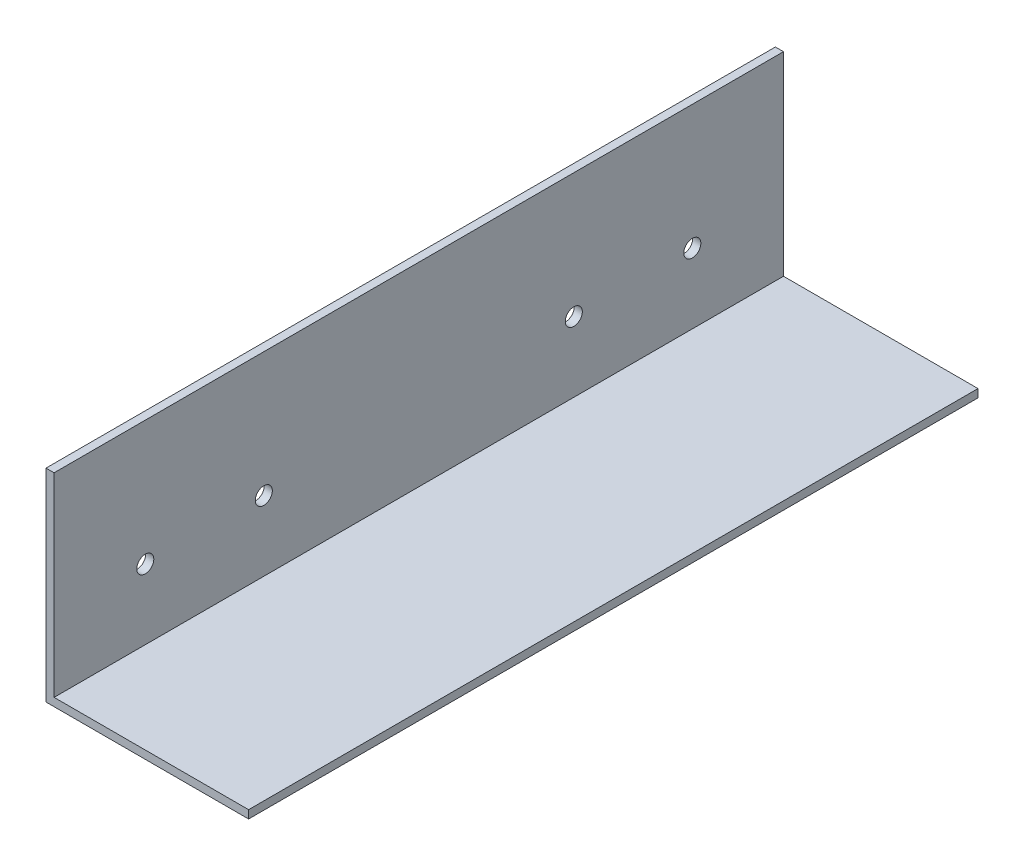
ISO-10303-21;
HEADER;
FILE_DESCRIPTION(('STEP AP214'),'2;1');
FILE_NAME('part.step','',(''),(''),'','','');
FILE_SCHEMA(('AUTOMOTIVE_DESIGN { 1 0 10303 214 1 1 1 1 }'));
ENDSEC;
DATA;
#1=APPLICATION_CONTEXT('core data for automotive mechanical design processes');
#2=APPLICATION_PROTOCOL_DEFINITION('international standard','automotive_design',2000,#1);
#3=PRODUCT_CONTEXT('',#1,'mechanical');
#4=PRODUCT('Part','Part','',(#3));
#5=PRODUCT_RELATED_PRODUCT_CATEGORY('part','',(#4));
#6=PRODUCT_DEFINITION_FORMATION('','',#4);
#7=PRODUCT_DEFINITION_CONTEXT('part definition',#1,'design');
#8=PRODUCT_DEFINITION('design','',#6,#7);
#9=PRODUCT_DEFINITION_SHAPE('','',#8);
#10=(LENGTH_UNIT() NAMED_UNIT(*) SI_UNIT(.MILLI.,.METRE.));
#11=(NAMED_UNIT(*) PLANE_ANGLE_UNIT() SI_UNIT($,.RADIAN.));
#12=(NAMED_UNIT(*) SI_UNIT($,.STERADIAN.) SOLID_ANGLE_UNIT());
#13=UNCERTAINTY_MEASURE_WITH_UNIT(LENGTH_MEASURE(1.E-05),#10,'distance_accuracy_value','');
#14=(GEOMETRIC_REPRESENTATION_CONTEXT(3) GLOBAL_UNCERTAINTY_ASSIGNED_CONTEXT((#13)) GLOBAL_UNIT_ASSIGNED_CONTEXT((#10,
#11,#12)) REPRESENTATION_CONTEXT('',''));
#15=CARTESIAN_POINT('',(0.,0.,0.));
#16=DIRECTION('',(0.,0.,1.));
#17=DIRECTION('',(1.,0.,0.));
#18=AXIS2_PLACEMENT_3D('',#15,#16,#17);
#19=CARTESIAN_POINT('',(0.,50.,180.));
#20=DIRECTION('',(1.,0.,0.));
#21=DIRECTION('',(0.,0.,-1.));
#22=AXIS2_PLACEMENT_3D('',#19,#20,#21);
#23=PLANE('',#22);
#24=CARTESIAN_POINT('',(0.,19.25,22.5));
#25=DIRECTION('',(1.,0.,0.));
#26=DIRECTION('',(0.,0.,-1.));
#27=AXIS2_PLACEMENT_3D('',#24,#25,#26);
#28=CIRCLE('',#27,2.1);
#29=CARTESIAN_POINT('',(0.,19.25,20.4));
#30=VERTEX_POINT('',#29);
#31=EDGE_CURVE('E127',#30,#30,#28,.T.);
#32=ORIENTED_EDGE('',*,*,#31,.T.);
#33=EDGE_LOOP('',(#32));
#34=FACE_BOUND('',#33,.T.);
#35=CARTESIAN_POINT('',(0.,19.25,51.75));
#36=DIRECTION('',(1.,0.,0.));
#37=DIRECTION('',(0.,0.,-1.));
#38=AXIS2_PLACEMENT_3D('',#35,#36,#37);
#39=CIRCLE('',#38,2.1);
#40=CARTESIAN_POINT('',(0.,19.25,49.65));
#41=VERTEX_POINT('',#40);
#42=EDGE_CURVE('E149',#41,#41,#39,.T.);
#43=ORIENTED_EDGE('',*,*,#42,.T.);
#44=EDGE_LOOP('',(#43));
#45=FACE_BOUND('',#44,.T.);
#46=CARTESIAN_POINT('',(0.,19.25,128.25));
#47=DIRECTION('',(1.,0.,0.));
#48=DIRECTION('',(0.,0.,-1.));
#49=AXIS2_PLACEMENT_3D('',#46,#47,#48);
#50=CIRCLE('',#49,2.09999999999999);
#51=CARTESIAN_POINT('',(0.,19.25,126.15));
#52=VERTEX_POINT('',#51);
#53=EDGE_CURVE('E146',#52,#52,#50,.T.);
#54=ORIENTED_EDGE('',*,*,#53,.T.);
#55=EDGE_LOOP('',(#54));
#56=FACE_BOUND('',#55,.T.);
#57=CARTESIAN_POINT('',(0.,19.25,157.5));
#58=DIRECTION('',(1.,0.,0.));
#59=DIRECTION('',(0.,0.,-1.));
#60=AXIS2_PLACEMENT_3D('',#57,#58,#59);
#61=CIRCLE('',#60,2.09999999999999);
#62=CARTESIAN_POINT('',(0.,19.25,155.4));
#63=VERTEX_POINT('',#62);
#64=EDGE_CURVE('E143',#63,#63,#61,.T.);
#65=ORIENTED_EDGE('',*,*,#64,.T.);
#66=EDGE_LOOP('',(#65));
#67=FACE_BOUND('',#66,.T.);
#68=DIRECTION('',(0.,-1.,0.));
#69=VECTOR('',#68,1.);
#70=CARTESIAN_POINT('',(0.,50.,0.));
#71=LINE('',#70,#69);
#72=CARTESIAN_POINT('',(0.,50.,0.));
#73=VERTEX_POINT('',#72);
#74=CARTESIAN_POINT('',(0.,0.,0.));
#75=VERTEX_POINT('',#74);
#76=EDGE_CURVE('E123',#73,#75,#71,.T.);
#77=ORIENTED_EDGE('',*,*,#76,.T.);
#78=DIRECTION('',(0.,0.,-1.));
#79=VECTOR('',#78,1.);
#80=CARTESIAN_POINT('',(0.,0.,180.));
#81=LINE('',#80,#79);
#82=CARTESIAN_POINT('',(0.,0.,180.));
#83=VERTEX_POINT('',#82);
#84=EDGE_CURVE('E11',#83,#75,#81,.T.);
#85=ORIENTED_EDGE('',*,*,#84,.F.);
#86=DIRECTION('',(0.,-1.,0.));
#87=VECTOR('',#86,1.);
#88=CARTESIAN_POINT('',(0.,50.,180.));
#89=LINE('',#88,#87);
#90=CARTESIAN_POINT('',(0.,50.,180.));
#91=VERTEX_POINT('',#90);
#92=EDGE_CURVE('E134',#91,#83,#89,.T.);
#93=ORIENTED_EDGE('',*,*,#92,.F.);
#94=DIRECTION('',(0.,0.,-1.));
#95=VECTOR('',#94,1.);
#96=CARTESIAN_POINT('',(0.,50.,180.));
#97=LINE('',#96,#95);
#98=EDGE_CURVE('E119',#91,#73,#97,.T.);
#99=ORIENTED_EDGE('',*,*,#98,.T.);
#100=EDGE_LOOP('',(#77,#85,#93,#99));
#101=FACE_BOUND('',#100,.T.);
#102=ADVANCED_FACE('F37',(#34,#45,#56,#67,#101),#23,.F.);
#103=CARTESIAN_POINT('',(0.,0.,180.));
#104=DIRECTION('',(0.,1.,0.));
#105=DIRECTION('',(0.,0.,1.));
#106=AXIS2_PLACEMENT_3D('',#103,#104,#105);
#107=PLANE('',#106);
#108=DIRECTION('',(1.,0.,0.));
#109=VECTOR('',#108,1.);
#110=CARTESIAN_POINT('',(0.,0.,0.));
#111=LINE('',#110,#109);
#112=CARTESIAN_POINT('',(50.,0.,0.));
#113=VERTEX_POINT('',#112);
#114=EDGE_CURVE('E126',#75,#113,#111,.T.);
#115=ORIENTED_EDGE('',*,*,#114,.T.);
#116=DIRECTION('',(0.,0.,-1.));
#117=VECTOR('',#116,1.);
#118=CARTESIAN_POINT('',(50.,0.,180.));
#119=LINE('',#118,#117);
#120=CARTESIAN_POINT('',(50.,0.,180.));
#121=VERTEX_POINT('',#120);
#122=EDGE_CURVE('E46',#121,#113,#119,.T.);
#123=ORIENTED_EDGE('',*,*,#122,.F.);
#124=DIRECTION('',(1.,0.,0.));
#125=VECTOR('',#124,1.);
#126=CARTESIAN_POINT('',(0.,0.,180.));
#127=LINE('',#126,#125);
#128=EDGE_CURVE('E92',#83,#121,#127,.T.);
#129=ORIENTED_EDGE('',*,*,#128,.F.);
#130=ORIENTED_EDGE('',*,*,#84,.T.);
#131=EDGE_LOOP('',(#115,#123,#129,#130));
#132=FACE_BOUND('',#131,.T.);
#133=ADVANCED_FACE('F165',(#132),#107,.F.);
#134=CARTESIAN_POINT('',(50.,0.,180.));
#135=DIRECTION('',(-1.,0.,0.));
#136=DIRECTION('',(0.,0.,1.));
#137=AXIS2_PLACEMENT_3D('',#134,#135,#136);
#138=PLANE('',#137);
#139=DIRECTION('',(0.,1.,0.));
#140=VECTOR('',#139,1.);
#141=CARTESIAN_POINT('',(50.,0.,0.));
#142=LINE('',#141,#140);
#143=CARTESIAN_POINT('',(50.,2.,0.));
#144=VERTEX_POINT('',#143);
#145=EDGE_CURVE('E129',#113,#144,#142,.T.);
#146=ORIENTED_EDGE('',*,*,#145,.T.);
#147=DIRECTION('',(0.,0.,-1.));
#148=VECTOR('',#147,1.);
#149=CARTESIAN_POINT('',(50.,2.,180.));
#150=LINE('',#149,#148);
#151=CARTESIAN_POINT('',(50.,2.,180.));
#152=VERTEX_POINT('',#151);
#153=EDGE_CURVE('E114',#152,#144,#150,.T.);
#154=ORIENTED_EDGE('',*,*,#153,.F.);
#155=DIRECTION('',(0.,1.,0.));
#156=VECTOR('',#155,1.);
#157=CARTESIAN_POINT('',(50.,0.,180.));
#158=LINE('',#157,#156);
#159=EDGE_CURVE('E105',#121,#152,#158,.T.);
#160=ORIENTED_EDGE('',*,*,#159,.F.);
#161=ORIENTED_EDGE('',*,*,#122,.T.);
#162=EDGE_LOOP('',(#146,#154,#160,#161));
#163=FACE_BOUND('',#162,.T.);
#164=ADVANCED_FACE('F168',(#163),#138,.F.);
#165=CARTESIAN_POINT('',(50.,2.,180.));
#166=DIRECTION('',(0.,-1.,0.));
#167=DIRECTION('',(0.,0.,-1.));
#168=AXIS2_PLACEMENT_3D('',#165,#166,#167);
#169=PLANE('',#168);
#170=DIRECTION('',(-1.,0.,0.));
#171=VECTOR('',#170,1.);
#172=CARTESIAN_POINT('',(50.,2.,0.));
#173=LINE('',#172,#171);
#174=CARTESIAN_POINT('',(2.,2.,0.));
#175=VERTEX_POINT('',#174);
#176=EDGE_CURVE('E113',#144,#175,#173,.T.);
#177=ORIENTED_EDGE('',*,*,#176,.T.);
#178=DIRECTION('',(0.,0.,-1.));
#179=VECTOR('',#178,1.);
#180=CARTESIAN_POINT('',(2.,2.,180.));
#181=LINE('',#180,#179);
#182=CARTESIAN_POINT('',(2.,2.,180.));
#183=VERTEX_POINT('',#182);
#184=EDGE_CURVE('E110',#183,#175,#181,.T.);
#185=ORIENTED_EDGE('',*,*,#184,.F.);
#186=DIRECTION('',(-1.,0.,0.));
#187=VECTOR('',#186,1.);
#188=CARTESIAN_POINT('',(50.,2.,180.));
#189=LINE('',#188,#187);
#190=EDGE_CURVE('E99',#152,#183,#189,.T.);
#191=ORIENTED_EDGE('',*,*,#190,.F.);
#192=ORIENTED_EDGE('',*,*,#153,.T.);
#193=EDGE_LOOP('',(#177,#185,#191,#192));
#194=FACE_BOUND('',#193,.T.);
#195=ADVANCED_FACE('F111',(#194),#169,.F.);
#196=CARTESIAN_POINT('',(2.,2.,180.));
#197=DIRECTION('',(-1.,0.,0.));
#198=DIRECTION('',(0.,0.,1.));
#199=AXIS2_PLACEMENT_3D('',#196,#197,#198);
#200=PLANE('',#199);
#201=CARTESIAN_POINT('',(2.,19.25,22.5));
#202=DIRECTION('',(-1.,0.,0.));
#203=DIRECTION('',(0.,0.,1.));
#204=AXIS2_PLACEMENT_3D('',#201,#202,#203);
#205=CIRCLE('',#204,2.1);
#206=CARTESIAN_POINT('',(2.,19.25,20.4));
#207=VERTEX_POINT('',#206);
#208=EDGE_CURVE('E40',#207,#207,#205,.T.);
#209=ORIENTED_EDGE('',*,*,#208,.T.);
#210=EDGE_LOOP('',(#209));
#211=FACE_BOUND('',#210,.T.);
#212=CARTESIAN_POINT('',(2.,19.25,51.75));
#213=DIRECTION('',(-1.,0.,0.));
#214=DIRECTION('',(0.,0.,1.));
#215=AXIS2_PLACEMENT_3D('',#212,#213,#214);
#216=CIRCLE('',#215,2.1);
#217=CARTESIAN_POINT('',(2.,19.25,49.65));
#218=VERTEX_POINT('',#217);
#219=EDGE_CURVE('E147',#218,#218,#216,.T.);
#220=ORIENTED_EDGE('',*,*,#219,.T.);
#221=EDGE_LOOP('',(#220));
#222=FACE_BOUND('',#221,.T.);
#223=CARTESIAN_POINT('',(2.,19.25,128.25));
#224=DIRECTION('',(-1.,0.,0.));
#225=DIRECTION('',(0.,0.,1.));
#226=AXIS2_PLACEMENT_3D('',#223,#224,#225);
#227=CIRCLE('',#226,2.09999999999999);
#228=CARTESIAN_POINT('',(2.,19.25,126.15));
#229=VERTEX_POINT('',#228);
#230=EDGE_CURVE('E144',#229,#229,#227,.T.);
#231=ORIENTED_EDGE('',*,*,#230,.T.);
#232=EDGE_LOOP('',(#231));
#233=FACE_BOUND('',#232,.T.);
#234=CARTESIAN_POINT('',(2.,19.25,157.5));
#235=DIRECTION('',(-1.,0.,0.));
#236=DIRECTION('',(0.,0.,1.));
#237=AXIS2_PLACEMENT_3D('',#234,#235,#236);
#238=CIRCLE('',#237,2.09999999999999);
#239=CARTESIAN_POINT('',(2.,19.25,155.4));
#240=VERTEX_POINT('',#239);
#241=EDGE_CURVE('E140',#240,#240,#238,.T.);
#242=ORIENTED_EDGE('',*,*,#241,.T.);
#243=EDGE_LOOP('',(#242));
#244=FACE_BOUND('',#243,.T.);
#245=DIRECTION('',(0.,1.,0.));
#246=VECTOR('',#245,1.);
#247=CARTESIAN_POINT('',(2.,2.,0.));
#248=LINE('',#247,#246);
#249=CARTESIAN_POINT('',(2.,50.,0.));
#250=VERTEX_POINT('',#249);
#251=EDGE_CURVE('E78',#175,#250,#248,.T.);
#252=ORIENTED_EDGE('',*,*,#251,.T.);
#253=DIRECTION('',(0.,0.,-1.));
#254=VECTOR('',#253,1.);
#255=CARTESIAN_POINT('',(2.,50.,180.));
#256=LINE('',#255,#254);
#257=CARTESIAN_POINT('',(2.,50.,180.));
#258=VERTEX_POINT('',#257);
#259=EDGE_CURVE('E115',#258,#250,#256,.T.);
#260=ORIENTED_EDGE('',*,*,#259,.F.);
#261=DIRECTION('',(0.,1.,0.));
#262=VECTOR('',#261,1.);
#263=CARTESIAN_POINT('',(2.,2.,180.));
#264=LINE('',#263,#262);
#265=EDGE_CURVE('E103',#183,#258,#264,.T.);
#266=ORIENTED_EDGE('',*,*,#265,.F.);
#267=ORIENTED_EDGE('',*,*,#184,.T.);
#268=EDGE_LOOP('',(#252,#260,#266,#267));
#269=FACE_BOUND('',#268,.T.);
#270=ADVANCED_FACE('F117',(#211,#222,#233,#244,#269),#200,.F.);
#271=CARTESIAN_POINT('',(2.,50.,180.));
#272=DIRECTION('',(0.,-1.,0.));
#273=DIRECTION('',(0.,0.,-1.));
#274=AXIS2_PLACEMENT_3D('',#271,#272,#273);
#275=PLANE('',#274);
#276=DIRECTION('',(-1.,0.,0.));
#277=VECTOR('',#276,1.);
#278=CARTESIAN_POINT('',(2.,50.,0.));
#279=LINE('',#278,#277);
#280=EDGE_CURVE('E84',#250,#73,#279,.T.);
#281=ORIENTED_EDGE('',*,*,#280,.T.);
#282=ORIENTED_EDGE('',*,*,#98,.F.);
#283=DIRECTION('',(-1.,0.,0.));
#284=VECTOR('',#283,1.);
#285=CARTESIAN_POINT('',(2.,50.,180.));
#286=LINE('',#285,#284);
#287=EDGE_CURVE('E55',#258,#91,#286,.T.);
#288=ORIENTED_EDGE('',*,*,#287,.F.);
#289=ORIENTED_EDGE('',*,*,#259,.T.);
#290=EDGE_LOOP('',(#281,#282,#288,#289));
#291=FACE_BOUND('',#290,.T.);
#292=ADVANCED_FACE('F173',(#291),#275,.F.);
#293=CARTESIAN_POINT('',(0.,0.,180.));
#294=DIRECTION('',(0.,0.,1.));
#295=DIRECTION('',(1.,0.,0.));
#296=AXIS2_PLACEMENT_3D('',#293,#294,#295);
#297=PLANE('',#296);
#298=ORIENTED_EDGE('',*,*,#92,.T.);
#299=ORIENTED_EDGE('',*,*,#128,.T.);
#300=ORIENTED_EDGE('',*,*,#159,.T.);
#301=ORIENTED_EDGE('',*,*,#190,.T.);
#302=ORIENTED_EDGE('',*,*,#265,.T.);
#303=ORIENTED_EDGE('',*,*,#287,.T.);
#304=EDGE_LOOP('',(#298,#299,#300,#301,#302,#303));
#305=FACE_BOUND('',#304,.T.);
#306=ADVANCED_FACE('F101',(#305),#297,.T.);
#307=CARTESIAN_POINT('',(0.,0.,0.));
#308=DIRECTION('',(0.,0.,1.));
#309=DIRECTION('',(1.,0.,0.));
#310=AXIS2_PLACEMENT_3D('',#307,#308,#309);
#311=PLANE('',#310);
#312=ORIENTED_EDGE('',*,*,#76,.F.);
#313=ORIENTED_EDGE('',*,*,#280,.F.);
#314=ORIENTED_EDGE('',*,*,#251,.F.);
#315=ORIENTED_EDGE('',*,*,#176,.F.);
#316=ORIENTED_EDGE('',*,*,#145,.F.);
#317=ORIENTED_EDGE('',*,*,#114,.F.);
#318=EDGE_LOOP('',(#312,#313,#314,#315,#316,#317));
#319=FACE_BOUND('',#318,.T.);
#320=ADVANCED_FACE('F171',(#319),#311,.F.);
#321=CARTESIAN_POINT('',(-5.,19.25,157.5));
#322=DIRECTION('',(1.,0.,0.));
#323=DIRECTION('',(0.,0.,-1.));
#324=AXIS2_PLACEMENT_3D('',#321,#322,#323);
#325=CYLINDRICAL_SURFACE('',#324,2.09999999999999);
#326=CARTESIAN_POINT('',(2.,19.25,155.4));
#327=CARTESIAN_POINT('',(1.97916666666667,19.25,155.4));
#328=CARTESIAN_POINT('',(1.95833333333334,19.25,155.4));
#329=CARTESIAN_POINT('',(1.91666666666667,19.25,155.4));
#330=CARTESIAN_POINT('',(1.89583333333334,19.25,155.4));
#331=CARTESIAN_POINT('',(1.85416666666667,19.25,155.4));
#332=CARTESIAN_POINT('',(1.83333333333334,19.25,155.4));
#333=CARTESIAN_POINT('',(1.79166666666667,19.25,155.4));
#334=CARTESIAN_POINT('',(1.77083333333334,19.25,155.4));
#335=CARTESIAN_POINT('',(1.72916666666667,19.25,155.4));
#336=CARTESIAN_POINT('',(1.70833333333333,19.25,155.4));
#337=CARTESIAN_POINT('',(1.66666666666667,19.25,155.4));
#338=CARTESIAN_POINT('',(1.64583333333333,19.25,155.4));
#339=CARTESIAN_POINT('',(1.60416666666667,19.25,155.4));
#340=CARTESIAN_POINT('',(1.58333333333333,19.25,155.4));
#341=CARTESIAN_POINT('',(1.54166666666667,19.25,155.4));
#342=CARTESIAN_POINT('',(1.52083333333333,19.25,155.4));
#343=CARTESIAN_POINT('',(1.47916666666667,19.25,155.4));
#344=CARTESIAN_POINT('',(1.45833333333333,19.25,155.4));
#345=CARTESIAN_POINT('',(1.41666666666667,19.25,155.4));
#346=CARTESIAN_POINT('',(1.39583333333333,19.25,155.4));
#347=CARTESIAN_POINT('',(1.35416666666667,19.25,155.4));
#348=CARTESIAN_POINT('',(1.33333333333333,19.25,155.4));
#349=CARTESIAN_POINT('',(1.29166666666667,19.25,155.4));
#350=CARTESIAN_POINT('',(1.27083333333333,19.25,155.4));
#351=CARTESIAN_POINT('',(1.22916666666667,19.25,155.4));
#352=CARTESIAN_POINT('',(1.20833333333333,19.25,155.4));
#353=CARTESIAN_POINT('',(1.16666666666667,19.25,155.4));
#354=CARTESIAN_POINT('',(1.14583333333333,19.25,155.4));
#355=CARTESIAN_POINT('',(1.10416666666667,19.25,155.4));
#356=CARTESIAN_POINT('',(1.08333333333333,19.25,155.4));
#357=CARTESIAN_POINT('',(1.04166666666667,19.25,155.4));
#358=CARTESIAN_POINT('',(1.02083333333333,19.25,155.4));
#359=CARTESIAN_POINT('',(0.979166666666668,19.25,155.4));
#360=CARTESIAN_POINT('',(0.958333333333334,19.25,155.4));
#361=CARTESIAN_POINT('',(0.916666666666668,19.25,155.4));
#362=CARTESIAN_POINT('',(0.895833333333334,19.25,155.4));
#363=CARTESIAN_POINT('',(0.854166666666667,19.25,155.4));
#364=CARTESIAN_POINT('',(0.833333333333334,19.25,155.4));
#365=CARTESIAN_POINT('',(0.791666666666667,19.25,155.4));
#366=CARTESIAN_POINT('',(0.770833333333334,19.25,155.4));
#367=CARTESIAN_POINT('',(0.729166666666667,19.25,155.4));
#368=CARTESIAN_POINT('',(0.708333333333334,19.25,155.4));
#369=CARTESIAN_POINT('',(0.666666666666667,19.25,155.4));
#370=CARTESIAN_POINT('',(0.645833333333334,19.25,155.4));
#371=CARTESIAN_POINT('',(0.604166666666667,19.25,155.4));
#372=CARTESIAN_POINT('',(0.583333333333334,19.25,155.4));
#373=CARTESIAN_POINT('',(0.541666666666667,19.25,155.4));
#374=CARTESIAN_POINT('',(0.520833333333334,19.25,155.4));
#375=CARTESIAN_POINT('',(0.479166666666667,19.25,155.4));
#376=CARTESIAN_POINT('',(0.458333333333334,19.25,155.4));
#377=CARTESIAN_POINT('',(0.416666666666667,19.25,155.4));
#378=CARTESIAN_POINT('',(0.395833333333334,19.25,155.4));
#379=CARTESIAN_POINT('',(0.354166666666667,19.25,155.4));
#380=CARTESIAN_POINT('',(0.333333333333334,19.25,155.4));
#381=CARTESIAN_POINT('',(0.291666666666667,19.25,155.4));
#382=CARTESIAN_POINT('',(0.270833333333334,19.25,155.4));
#383=CARTESIAN_POINT('',(0.229166666666667,19.25,155.4));
#384=CARTESIAN_POINT('',(0.208333333333334,19.25,155.4));
#385=CARTESIAN_POINT('',(0.166666666666667,19.25,155.4));
#386=CARTESIAN_POINT('',(0.145833333333333,19.25,155.4));
#387=CARTESIAN_POINT('',(0.104166666666667,19.25,155.4));
#388=CARTESIAN_POINT('',(0.0833333333333334,19.25,155.4));
#389=CARTESIAN_POINT('',(0.0416666666666667,19.25,155.4));
#390=CARTESIAN_POINT('',(0.0208333333333333,19.25,155.4));
#391=CARTESIAN_POINT('',(0.,19.25,155.4));
#392=B_SPLINE_CURVE_WITH_KNOTS('',3,(#326,#327,#328,#329,#330,#331,#332,#333,#334,#335,#336,
#337,#338,#339,#340,#341,#342,#343,#344,#345,#346,#347,#348,#349,#350,#351,#352,#353,#354,#355,
#356,#357,#358,#359,#360,#361,#362,#363,#364,#365,#366,#367,#368,#369,#370,#371,#372,#373,#374,
#375,#376,#377,#378,#379,#380,#381,#382,#383,#384,#385,#386,#387,#388,#389,#390,#391),
.UNSPECIFIED.,.F.,.F.,(4,2,2,2,2,2,2,2,2,2,2,2,2,2,2,2,2,2,2,2,2,2,2,2,2,2,2,2,2,2,2,2,4),(0.,
0.0625000000000001,0.125,0.1875,0.25,0.3125,0.375,0.4375,0.5,0.5625,0.625000000000001,
0.687500000000001,0.750000000000001,0.812500000000001,0.875000000000001,0.937500000000001,1.,
1.0625,1.125,1.1875,1.25,1.3125,1.375,1.4375,1.5,1.5625,1.625,1.6875,1.75,1.8125,1.875,1.9375,
2.),.UNSPECIFIED.);
#393=EDGE_CURVE('BSEAM196',#240,#63,#392,.T.);
#394=ORIENTED_EDGE('',*,*,#241,.F.);
#395=ORIENTED_EDGE('',*,*,#64,.F.);
#396=ORIENTED_EDGE('',*,*,#393,.T.);
#397=ORIENTED_EDGE('',*,*,#393,.F.);
#398=EDGE_LOOP('',(#394,#396,#395,#397));
#399=FACE_BOUND('',#398,.T.);
#400=ADVANCED_FACE('F196',(#399),#325,.F.);
#401=CARTESIAN_POINT('',(-5.,19.25,128.25));
#402=DIRECTION('',(1.,0.,0.));
#403=DIRECTION('',(0.,0.,-1.));
#404=AXIS2_PLACEMENT_3D('',#401,#402,#403);
#405=CYLINDRICAL_SURFACE('',#404,2.09999999999999);
#406=CARTESIAN_POINT('',(2.,19.25,126.15));
#407=CARTESIAN_POINT('',(1.97916666666667,19.25,126.15));
#408=CARTESIAN_POINT('',(1.95833333333334,19.25,126.15));
#409=CARTESIAN_POINT('',(1.91666666666667,19.25,126.15));
#410=CARTESIAN_POINT('',(1.89583333333334,19.25,126.15));
#411=CARTESIAN_POINT('',(1.85416666666667,19.25,126.15));
#412=CARTESIAN_POINT('',(1.83333333333334,19.25,126.15));
#413=CARTESIAN_POINT('',(1.79166666666667,19.25,126.15));
#414=CARTESIAN_POINT('',(1.77083333333334,19.25,126.15));
#415=CARTESIAN_POINT('',(1.72916666666667,19.25,126.15));
#416=CARTESIAN_POINT('',(1.70833333333333,19.25,126.15));
#417=CARTESIAN_POINT('',(1.66666666666667,19.25,126.15));
#418=CARTESIAN_POINT('',(1.64583333333333,19.25,126.15));
#419=CARTESIAN_POINT('',(1.60416666666667,19.25,126.15));
#420=CARTESIAN_POINT('',(1.58333333333333,19.25,126.15));
#421=CARTESIAN_POINT('',(1.54166666666667,19.25,126.15));
#422=CARTESIAN_POINT('',(1.52083333333333,19.25,126.15));
#423=CARTESIAN_POINT('',(1.47916666666667,19.25,126.15));
#424=CARTESIAN_POINT('',(1.45833333333333,19.25,126.15));
#425=CARTESIAN_POINT('',(1.41666666666667,19.25,126.15));
#426=CARTESIAN_POINT('',(1.39583333333333,19.25,126.15));
#427=CARTESIAN_POINT('',(1.35416666666667,19.25,126.15));
#428=CARTESIAN_POINT('',(1.33333333333333,19.25,126.15));
#429=CARTESIAN_POINT('',(1.29166666666667,19.25,126.15));
#430=CARTESIAN_POINT('',(1.27083333333333,19.25,126.15));
#431=CARTESIAN_POINT('',(1.22916666666667,19.25,126.15));
#432=CARTESIAN_POINT('',(1.20833333333333,19.25,126.15));
#433=CARTESIAN_POINT('',(1.16666666666667,19.25,126.15));
#434=CARTESIAN_POINT('',(1.14583333333333,19.25,126.15));
#435=CARTESIAN_POINT('',(1.10416666666667,19.25,126.15));
#436=CARTESIAN_POINT('',(1.08333333333333,19.25,126.15));
#437=CARTESIAN_POINT('',(1.04166666666667,19.25,126.15));
#438=CARTESIAN_POINT('',(1.02083333333333,19.25,126.15));
#439=CARTESIAN_POINT('',(0.979166666666668,19.25,126.15));
#440=CARTESIAN_POINT('',(0.958333333333334,19.25,126.15));
#441=CARTESIAN_POINT('',(0.916666666666668,19.25,126.15));
#442=CARTESIAN_POINT('',(0.895833333333334,19.25,126.15));
#443=CARTESIAN_POINT('',(0.854166666666667,19.25,126.15));
#444=CARTESIAN_POINT('',(0.833333333333334,19.25,126.15));
#445=CARTESIAN_POINT('',(0.791666666666667,19.25,126.15));
#446=CARTESIAN_POINT('',(0.770833333333334,19.25,126.15));
#447=CARTESIAN_POINT('',(0.729166666666667,19.25,126.15));
#448=CARTESIAN_POINT('',(0.708333333333334,19.25,126.15));
#449=CARTESIAN_POINT('',(0.666666666666667,19.25,126.15));
#450=CARTESIAN_POINT('',(0.645833333333334,19.25,126.15));
#451=CARTESIAN_POINT('',(0.604166666666667,19.25,126.15));
#452=CARTESIAN_POINT('',(0.583333333333334,19.25,126.15));
#453=CARTESIAN_POINT('',(0.541666666666667,19.25,126.15));
#454=CARTESIAN_POINT('',(0.520833333333334,19.25,126.15));
#455=CARTESIAN_POINT('',(0.479166666666667,19.25,126.15));
#456=CARTESIAN_POINT('',(0.458333333333334,19.25,126.15));
#457=CARTESIAN_POINT('',(0.416666666666667,19.25,126.15));
#458=CARTESIAN_POINT('',(0.395833333333334,19.25,126.15));
#459=CARTESIAN_POINT('',(0.354166666666667,19.25,126.15));
#460=CARTESIAN_POINT('',(0.333333333333334,19.25,126.15));
#461=CARTESIAN_POINT('',(0.291666666666667,19.25,126.15));
#462=CARTESIAN_POINT('',(0.270833333333334,19.25,126.15));
#463=CARTESIAN_POINT('',(0.229166666666667,19.25,126.15));
#464=CARTESIAN_POINT('',(0.208333333333334,19.25,126.15));
#465=CARTESIAN_POINT('',(0.166666666666667,19.25,126.15));
#466=CARTESIAN_POINT('',(0.145833333333333,19.25,126.15));
#467=CARTESIAN_POINT('',(0.104166666666667,19.25,126.15));
#468=CARTESIAN_POINT('',(0.0833333333333334,19.25,126.15));
#469=CARTESIAN_POINT('',(0.0416666666666667,19.25,126.15));
#470=CARTESIAN_POINT('',(0.0208333333333333,19.25,126.15));
#471=CARTESIAN_POINT('',(0.,19.25,126.15));
#472=B_SPLINE_CURVE_WITH_KNOTS('',3,(#406,#407,#408,#409,#410,#411,#412,#413,#414,#415,#416,
#417,#418,#419,#420,#421,#422,#423,#424,#425,#426,#427,#428,#429,#430,#431,#432,#433,#434,#435,
#436,#437,#438,#439,#440,#441,#442,#443,#444,#445,#446,#447,#448,#449,#450,#451,#452,#453,#454,
#455,#456,#457,#458,#459,#460,#461,#462,#463,#464,#465,#466,#467,#468,#469,#470,#471),
.UNSPECIFIED.,.F.,.F.,(4,2,2,2,2,2,2,2,2,2,2,2,2,2,2,2,2,2,2,2,2,2,2,2,2,2,2,2,2,2,2,2,4),(0.,
0.0625000000000001,0.125,0.1875,0.25,0.3125,0.375,0.4375,0.5,0.5625,0.625000000000001,
0.687500000000001,0.750000000000001,0.812500000000001,0.875000000000001,0.937500000000001,1.,
1.0625,1.125,1.1875,1.25,1.3125,1.375,1.4375,1.5,1.5625,1.625,1.6875,1.75,1.8125,1.875,1.9375,
2.),.UNSPECIFIED.);
#473=EDGE_CURVE('BSEAM198',#229,#52,#472,.T.);
#474=ORIENTED_EDGE('',*,*,#230,.F.);
#475=ORIENTED_EDGE('',*,*,#53,.F.);
#476=ORIENTED_EDGE('',*,*,#473,.T.);
#477=ORIENTED_EDGE('',*,*,#473,.F.);
#478=EDGE_LOOP('',(#474,#476,#475,#477));
#479=FACE_BOUND('',#478,.T.);
#480=ADVANCED_FACE('F198',(#479),#405,.F.);
#481=CARTESIAN_POINT('',(-5.,19.25,51.75));
#482=DIRECTION('',(1.,0.,0.));
#483=DIRECTION('',(0.,0.,-1.));
#484=AXIS2_PLACEMENT_3D('',#481,#482,#483);
#485=CYLINDRICAL_SURFACE('',#484,2.1);
#486=CARTESIAN_POINT('',(2.,19.25,49.65));
#487=CARTESIAN_POINT('',(1.97916666666667,19.25,49.65));
#488=CARTESIAN_POINT('',(1.95833333333334,19.25,49.65));
#489=CARTESIAN_POINT('',(1.91666666666667,19.25,49.65));
#490=CARTESIAN_POINT('',(1.89583333333334,19.25,49.65));
#491=CARTESIAN_POINT('',(1.85416666666667,19.25,49.65));
#492=CARTESIAN_POINT('',(1.83333333333334,19.25,49.65));
#493=CARTESIAN_POINT('',(1.79166666666667,19.25,49.65));
#494=CARTESIAN_POINT('',(1.77083333333334,19.25,49.65));
#495=CARTESIAN_POINT('',(1.72916666666667,19.25,49.65));
#496=CARTESIAN_POINT('',(1.70833333333333,19.25,49.65));
#497=CARTESIAN_POINT('',(1.66666666666667,19.25,49.65));
#498=CARTESIAN_POINT('',(1.64583333333333,19.25,49.65));
#499=CARTESIAN_POINT('',(1.60416666666667,19.25,49.65));
#500=CARTESIAN_POINT('',(1.58333333333333,19.25,49.65));
#501=CARTESIAN_POINT('',(1.54166666666667,19.25,49.65));
#502=CARTESIAN_POINT('',(1.52083333333333,19.25,49.65));
#503=CARTESIAN_POINT('',(1.47916666666667,19.25,49.65));
#504=CARTESIAN_POINT('',(1.45833333333333,19.25,49.65));
#505=CARTESIAN_POINT('',(1.41666666666667,19.25,49.65));
#506=CARTESIAN_POINT('',(1.39583333333333,19.25,49.65));
#507=CARTESIAN_POINT('',(1.35416666666667,19.25,49.65));
#508=CARTESIAN_POINT('',(1.33333333333333,19.25,49.65));
#509=CARTESIAN_POINT('',(1.29166666666667,19.25,49.65));
#510=CARTESIAN_POINT('',(1.27083333333333,19.25,49.65));
#511=CARTESIAN_POINT('',(1.22916666666667,19.25,49.65));
#512=CARTESIAN_POINT('',(1.20833333333333,19.25,49.65));
#513=CARTESIAN_POINT('',(1.16666666666667,19.25,49.65));
#514=CARTESIAN_POINT('',(1.14583333333333,19.25,49.65));
#515=CARTESIAN_POINT('',(1.10416666666667,19.25,49.65));
#516=CARTESIAN_POINT('',(1.08333333333333,19.25,49.65));
#517=CARTESIAN_POINT('',(1.04166666666667,19.25,49.65));
#518=CARTESIAN_POINT('',(1.02083333333333,19.25,49.65));
#519=CARTESIAN_POINT('',(0.979166666666668,19.25,49.65));
#520=CARTESIAN_POINT('',(0.958333333333334,19.25,49.65));
#521=CARTESIAN_POINT('',(0.916666666666668,19.25,49.65));
#522=CARTESIAN_POINT('',(0.895833333333334,19.25,49.65));
#523=CARTESIAN_POINT('',(0.854166666666667,19.25,49.65));
#524=CARTESIAN_POINT('',(0.833333333333334,19.25,49.65));
#525=CARTESIAN_POINT('',(0.791666666666667,19.25,49.65));
#526=CARTESIAN_POINT('',(0.770833333333334,19.25,49.65));
#527=CARTESIAN_POINT('',(0.729166666666667,19.25,49.65));
#528=CARTESIAN_POINT('',(0.708333333333334,19.25,49.65));
#529=CARTESIAN_POINT('',(0.666666666666667,19.25,49.65));
#530=CARTESIAN_POINT('',(0.645833333333334,19.25,49.65));
#531=CARTESIAN_POINT('',(0.604166666666667,19.25,49.65));
#532=CARTESIAN_POINT('',(0.583333333333334,19.25,49.65));
#533=CARTESIAN_POINT('',(0.541666666666667,19.25,49.65));
#534=CARTESIAN_POINT('',(0.520833333333334,19.25,49.65));
#535=CARTESIAN_POINT('',(0.479166666666667,19.25,49.65));
#536=CARTESIAN_POINT('',(0.458333333333334,19.25,49.65));
#537=CARTESIAN_POINT('',(0.416666666666667,19.25,49.65));
#538=CARTESIAN_POINT('',(0.395833333333334,19.25,49.65));
#539=CARTESIAN_POINT('',(0.354166666666667,19.25,49.65));
#540=CARTESIAN_POINT('',(0.333333333333334,19.25,49.65));
#541=CARTESIAN_POINT('',(0.291666666666667,19.25,49.65));
#542=CARTESIAN_POINT('',(0.270833333333334,19.25,49.65));
#543=CARTESIAN_POINT('',(0.229166666666667,19.25,49.65));
#544=CARTESIAN_POINT('',(0.208333333333334,19.25,49.65));
#545=CARTESIAN_POINT('',(0.166666666666667,19.25,49.65));
#546=CARTESIAN_POINT('',(0.145833333333333,19.25,49.65));
#547=CARTESIAN_POINT('',(0.104166666666667,19.25,49.65));
#548=CARTESIAN_POINT('',(0.0833333333333334,19.25,49.65));
#549=CARTESIAN_POINT('',(0.0416666666666667,19.25,49.65));
#550=CARTESIAN_POINT('',(0.0208333333333333,19.25,49.65));
#551=CARTESIAN_POINT('',(0.,19.25,49.65));
#552=B_SPLINE_CURVE_WITH_KNOTS('',3,(#486,#487,#488,#489,#490,#491,#492,#493,#494,#495,#496,
#497,#498,#499,#500,#501,#502,#503,#504,#505,#506,#507,#508,#509,#510,#511,#512,#513,#514,#515,
#516,#517,#518,#519,#520,#521,#522,#523,#524,#525,#526,#527,#528,#529,#530,#531,#532,#533,#534,
#535,#536,#537,#538,#539,#540,#541,#542,#543,#544,#545,#546,#547,#548,#549,#550,#551),
.UNSPECIFIED.,.F.,.F.,(4,2,2,2,2,2,2,2,2,2,2,2,2,2,2,2,2,2,2,2,2,2,2,2,2,2,2,2,2,2,2,2,4),(0.,
0.0625000000000001,0.125,0.1875,0.25,0.3125,0.375,0.4375,0.5,0.5625,0.625000000000001,
0.687500000000001,0.750000000000001,0.812500000000001,0.875000000000001,0.937500000000001,1.,
1.0625,1.125,1.1875,1.25,1.3125,1.375,1.4375,1.5,1.5625,1.625,1.6875,1.75,1.8125,1.875,1.9375,
2.),.UNSPECIFIED.);
#553=EDGE_CURVE('BSEAM205',#218,#41,#552,.T.);
#554=ORIENTED_EDGE('',*,*,#219,.F.);
#555=ORIENTED_EDGE('',*,*,#42,.F.);
#556=ORIENTED_EDGE('',*,*,#553,.T.);
#557=ORIENTED_EDGE('',*,*,#553,.F.);
#558=EDGE_LOOP('',(#554,#556,#555,#557));
#559=FACE_BOUND('',#558,.T.);
#560=ADVANCED_FACE('F205',(#559),#485,.F.);
#561=CARTESIAN_POINT('',(-5.,19.25,22.5));
#562=DIRECTION('',(1.,0.,0.));
#563=DIRECTION('',(0.,0.,-1.));
#564=AXIS2_PLACEMENT_3D('',#561,#562,#563);
#565=CYLINDRICAL_SURFACE('',#564,2.1);
#566=CARTESIAN_POINT('',(2.,19.25,20.4));
#567=CARTESIAN_POINT('',(1.97916666666667,19.25,20.4));
#568=CARTESIAN_POINT('',(1.95833333333334,19.25,20.4));
#569=CARTESIAN_POINT('',(1.91666666666667,19.25,20.4));
#570=CARTESIAN_POINT('',(1.89583333333334,19.25,20.4));
#571=CARTESIAN_POINT('',(1.85416666666667,19.25,20.4));
#572=CARTESIAN_POINT('',(1.83333333333334,19.25,20.4));
#573=CARTESIAN_POINT('',(1.79166666666667,19.25,20.4));
#574=CARTESIAN_POINT('',(1.77083333333334,19.25,20.4));
#575=CARTESIAN_POINT('',(1.72916666666667,19.25,20.4));
#576=CARTESIAN_POINT('',(1.70833333333333,19.25,20.4));
#577=CARTESIAN_POINT('',(1.66666666666667,19.25,20.4));
#578=CARTESIAN_POINT('',(1.64583333333333,19.25,20.4));
#579=CARTESIAN_POINT('',(1.60416666666667,19.25,20.4));
#580=CARTESIAN_POINT('',(1.58333333333333,19.25,20.4));
#581=CARTESIAN_POINT('',(1.54166666666667,19.25,20.4));
#582=CARTESIAN_POINT('',(1.52083333333333,19.25,20.4));
#583=CARTESIAN_POINT('',(1.47916666666667,19.25,20.4));
#584=CARTESIAN_POINT('',(1.45833333333333,19.25,20.4));
#585=CARTESIAN_POINT('',(1.41666666666667,19.25,20.4));
#586=CARTESIAN_POINT('',(1.39583333333333,19.25,20.4));
#587=CARTESIAN_POINT('',(1.35416666666667,19.25,20.4));
#588=CARTESIAN_POINT('',(1.33333333333333,19.25,20.4));
#589=CARTESIAN_POINT('',(1.29166666666667,19.25,20.4));
#590=CARTESIAN_POINT('',(1.27083333333333,19.25,20.4));
#591=CARTESIAN_POINT('',(1.22916666666667,19.25,20.4));
#592=CARTESIAN_POINT('',(1.20833333333333,19.25,20.4));
#593=CARTESIAN_POINT('',(1.16666666666667,19.25,20.4));
#594=CARTESIAN_POINT('',(1.14583333333333,19.25,20.4));
#595=CARTESIAN_POINT('',(1.10416666666667,19.25,20.4));
#596=CARTESIAN_POINT('',(1.08333333333333,19.25,20.4));
#597=CARTESIAN_POINT('',(1.04166666666667,19.25,20.4));
#598=CARTESIAN_POINT('',(1.02083333333333,19.25,20.4));
#599=CARTESIAN_POINT('',(0.979166666666668,19.25,20.4));
#600=CARTESIAN_POINT('',(0.958333333333334,19.25,20.4));
#601=CARTESIAN_POINT('',(0.916666666666668,19.25,20.4));
#602=CARTESIAN_POINT('',(0.895833333333334,19.25,20.4));
#603=CARTESIAN_POINT('',(0.854166666666667,19.25,20.4));
#604=CARTESIAN_POINT('',(0.833333333333334,19.25,20.4));
#605=CARTESIAN_POINT('',(0.791666666666667,19.25,20.4));
#606=CARTESIAN_POINT('',(0.770833333333334,19.25,20.4));
#607=CARTESIAN_POINT('',(0.729166666666667,19.25,20.4));
#608=CARTESIAN_POINT('',(0.708333333333334,19.25,20.4));
#609=CARTESIAN_POINT('',(0.666666666666667,19.25,20.4));
#610=CARTESIAN_POINT('',(0.645833333333334,19.25,20.4));
#611=CARTESIAN_POINT('',(0.604166666666667,19.25,20.4));
#612=CARTESIAN_POINT('',(0.583333333333334,19.25,20.4));
#613=CARTESIAN_POINT('',(0.541666666666667,19.25,20.4));
#614=CARTESIAN_POINT('',(0.520833333333334,19.25,20.4));
#615=CARTESIAN_POINT('',(0.479166666666667,19.25,20.4));
#616=CARTESIAN_POINT('',(0.458333333333334,19.25,20.4));
#617=CARTESIAN_POINT('',(0.416666666666667,19.25,20.4));
#618=CARTESIAN_POINT('',(0.395833333333334,19.25,20.4));
#619=CARTESIAN_POINT('',(0.354166666666667,19.25,20.4));
#620=CARTESIAN_POINT('',(0.333333333333334,19.25,20.4));
#621=CARTESIAN_POINT('',(0.291666666666667,19.25,20.4));
#622=CARTESIAN_POINT('',(0.270833333333334,19.25,20.4));
#623=CARTESIAN_POINT('',(0.229166666666667,19.25,20.4));
#624=CARTESIAN_POINT('',(0.208333333333334,19.25,20.4));
#625=CARTESIAN_POINT('',(0.166666666666667,19.25,20.4));
#626=CARTESIAN_POINT('',(0.145833333333333,19.25,20.4));
#627=CARTESIAN_POINT('',(0.104166666666667,19.25,20.4));
#628=CARTESIAN_POINT('',(0.0833333333333334,19.25,20.4));
#629=CARTESIAN_POINT('',(0.0416666666666667,19.25,20.4));
#630=CARTESIAN_POINT('',(0.0208333333333333,19.25,20.4));
#631=CARTESIAN_POINT('',(0.,19.25,20.4));
#632=B_SPLINE_CURVE_WITH_KNOTS('',3,(#566,#567,#568,#569,#570,#571,#572,#573,#574,#575,#576,
#577,#578,#579,#580,#581,#582,#583,#584,#585,#586,#587,#588,#589,#590,#591,#592,#593,#594,#595,
#596,#597,#598,#599,#600,#601,#602,#603,#604,#605,#606,#607,#608,#609,#610,#611,#612,#613,#614,
#615,#616,#617,#618,#619,#620,#621,#622,#623,#624,#625,#626,#627,#628,#629,#630,#631),
.UNSPECIFIED.,.F.,.F.,(4,2,2,2,2,2,2,2,2,2,2,2,2,2,2,2,2,2,2,2,2,2,2,2,2,2,2,2,2,2,2,2,4),(0.,
0.0625000000000001,0.125,0.1875,0.25,0.3125,0.375,0.4375,0.5,0.5625,0.625000000000001,
0.687500000000001,0.750000000000001,0.812500000000001,0.875000000000001,0.937500000000001,1.,
1.0625,1.125,1.1875,1.25,1.3125,1.375,1.4375,1.5,1.5625,1.625,1.6875,1.75,1.8125,1.875,1.9375,
2.),.UNSPECIFIED.);
#633=EDGE_CURVE('BSEAM212',#207,#30,#632,.T.);
#634=ORIENTED_EDGE('',*,*,#208,.F.);
#635=ORIENTED_EDGE('',*,*,#31,.F.);
#636=ORIENTED_EDGE('',*,*,#633,.T.);
#637=ORIENTED_EDGE('',*,*,#633,.F.);
#638=EDGE_LOOP('',(#634,#636,#635,#637));
#639=FACE_BOUND('',#638,.T.);
#640=ADVANCED_FACE('F212',(#639),#565,.F.);
#641=CLOSED_SHELL('',(#102,#133,#164,#195,#270,#292,#306,#320,#400,#480,#560,#640));
#642=MANIFOLD_SOLID_BREP('B2',#641);
#643=ADVANCED_BREP_SHAPE_REPRESENTATION('',(#18,#642),#14);
#644=SHAPE_DEFINITION_REPRESENTATION(#9,#643);
ENDSEC;
END-ISO-10303-21;
